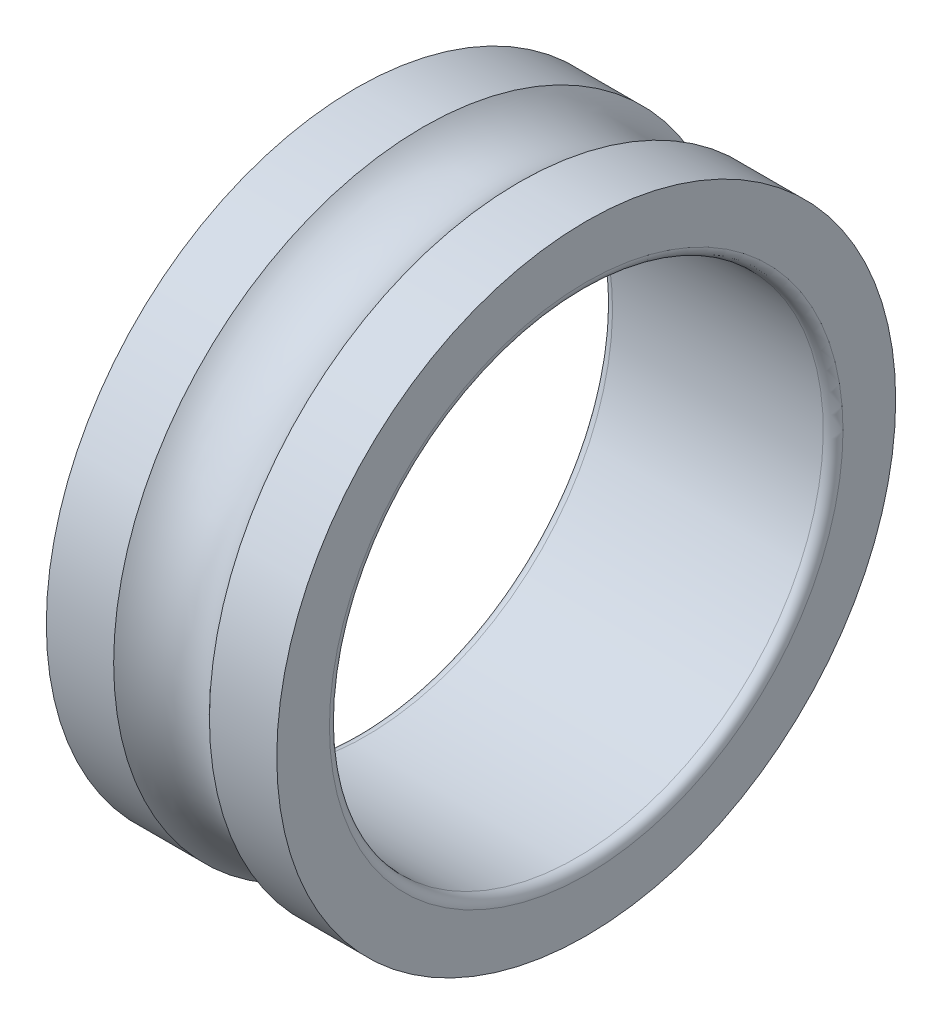
ISO-10303-21;
HEADER;
FILE_DESCRIPTION(('STEP AP214'),'2;1');
FILE_NAME('part.step','',(''),(''),'','','');
FILE_SCHEMA(('AUTOMOTIVE_DESIGN { 1 0 10303 214 1 1 1 1 }'));
ENDSEC;
DATA;
#1=APPLICATION_CONTEXT('core data for automotive mechanical design processes');
#2=APPLICATION_PROTOCOL_DEFINITION('international standard','automotive_design',2000,#1);
#3=PRODUCT_CONTEXT('',#1,'mechanical');
#4=PRODUCT('Part','Part','',(#3));
#5=PRODUCT_RELATED_PRODUCT_CATEGORY('part','',(#4));
#6=PRODUCT_DEFINITION_FORMATION('','',#4);
#7=PRODUCT_DEFINITION_CONTEXT('part definition',#1,'design');
#8=PRODUCT_DEFINITION('design','',#6,#7);
#9=PRODUCT_DEFINITION_SHAPE('','',#8);
#10=(LENGTH_UNIT() NAMED_UNIT(*) SI_UNIT(.MILLI.,.METRE.));
#11=(NAMED_UNIT(*) PLANE_ANGLE_UNIT() SI_UNIT($,.RADIAN.));
#12=(NAMED_UNIT(*) SI_UNIT($,.STERADIAN.) SOLID_ANGLE_UNIT());
#13=UNCERTAINTY_MEASURE_WITH_UNIT(LENGTH_MEASURE(1.E-05),#10,'distance_accuracy_value','');
#14=(GEOMETRIC_REPRESENTATION_CONTEXT(3) GLOBAL_UNCERTAINTY_ASSIGNED_CONTEXT((#13)) GLOBAL_UNIT_ASSIGNED_CONTEXT((#10,
#11,#12)) REPRESENTATION_CONTEXT('',''));
#15=CARTESIAN_POINT('',(0.,0.,0.));
#16=DIRECTION('',(0.,0.,1.));
#17=DIRECTION('',(1.,0.,0.));
#18=AXIS2_PLACEMENT_3D('',#15,#16,#17);
#19=CARTESIAN_POINT('',(5.97727921907614,0.,0.));
#20=DIRECTION('',(-1.,0.,0.));
#21=DIRECTION('',(0.,1.,0.));
#22=AXIS2_PLACEMENT_3D('',#19,#20,#21);
#23=CYLINDRICAL_SURFACE('',#22,9.4);
#24=CARTESIAN_POINT('',(4.95455843815228,0.,0.));
#25=DIRECTION('',(1.,0.,0.));
#26=DIRECTION('',(0.,1.,0.));
#27=AXIS2_PLACEMENT_3D('',#24,#25,#26);
#28=CIRCLE('',#27,9.4);
#29=CARTESIAN_POINT('',(4.95455843815228,9.4,0.));
#30=VERTEX_POINT('',#29);
#31=EDGE_CURVE('E11',#30,#30,#28,.T.);
#32=ORIENTED_EDGE('',*,*,#31,.T.);
#33=EDGE_LOOP('',(#32));
#34=FACE_BOUND('',#33,.T.);
#35=CARTESIAN_POINT('',(7.,0.,0.));
#36=DIRECTION('',(1.,0.,0.));
#37=DIRECTION('',(0.,1.,0.));
#38=AXIS2_PLACEMENT_3D('',#35,#36,#37);
#39=CIRCLE('',#38,9.4);
#40=CARTESIAN_POINT('',(7.,9.4,0.));
#41=VERTEX_POINT('',#40);
#42=EDGE_CURVE('E52',#41,#41,#39,.T.);
#43=ORIENTED_EDGE('',*,*,#42,.F.);
#44=EDGE_LOOP('',(#43));
#45=FACE_BOUND('',#44,.T.);
#46=ADVANCED_FACE('F16',(#34,#45),#23,.T.);
#47=CARTESIAN_POINT('',(3.5,0.,0.));
#48=DIRECTION('',(1.,0.,0.));
#49=DIRECTION('',(0.,0.,-1.));
#50=AXIS2_PLACEMENT_3D('',#47,#48,#49);
#51=TOROIDAL_SURFACE('',#50,10.75,1.9845);
#52=CARTESIAN_POINT('',(2.04544156184773,0.,0.));
#53=DIRECTION('',(1.,0.,0.));
#54=DIRECTION('',(0.,1.,0.));
#55=AXIS2_PLACEMENT_3D('',#52,#53,#54);
#56=CIRCLE('',#55,9.4);
#57=CARTESIAN_POINT('',(2.04544156184773,9.4,0.));
#58=VERTEX_POINT('',#57);
#59=EDGE_CURVE('E25',#58,#58,#56,.T.);
#60=ORIENTED_EDGE('',*,*,#59,.T.);
#61=EDGE_LOOP('',(#60));
#62=FACE_BOUND('',#61,.T.);
#63=ORIENTED_EDGE('',*,*,#31,.F.);
#64=EDGE_LOOP('',(#63));
#65=FACE_BOUND('',#64,.T.);
#66=ADVANCED_FACE('F18',(#62,#65),#51,.F.);
#67=CARTESIAN_POINT('',(1.02272078092386,0.,0.));
#68=DIRECTION('',(-1.,0.,0.));
#69=DIRECTION('',(0.,1.,0.));
#70=AXIS2_PLACEMENT_3D('',#67,#68,#69);
#71=CYLINDRICAL_SURFACE('',#70,9.4);
#72=CARTESIAN_POINT('',(0.,0.,0.));
#73=DIRECTION('',(1.,0.,0.));
#74=DIRECTION('',(0.,1.,0.));
#75=AXIS2_PLACEMENT_3D('',#72,#73,#74);
#76=CIRCLE('',#75,9.4);
#77=CARTESIAN_POINT('',(0.,9.4,0.));
#78=VERTEX_POINT('',#77);
#79=EDGE_CURVE('E64',#78,#78,#76,.T.);
#80=ORIENTED_EDGE('',*,*,#79,.T.);
#81=EDGE_LOOP('',(#80));
#82=FACE_BOUND('',#81,.T.);
#83=ORIENTED_EDGE('',*,*,#59,.F.);
#84=EDGE_LOOP('',(#83));
#85=FACE_BOUND('',#84,.T.);
#86=ADVANCED_FACE('F91',(#82,#85),#71,.T.);
#87=CARTESIAN_POINT('',(0.,8.6,0.));
#88=DIRECTION('',(-1.,0.,0.));
#89=DIRECTION('',(0.,-1.,0.));
#90=AXIS2_PLACEMENT_3D('',#87,#88,#89);
#91=PLANE('',#90);
#92=CARTESIAN_POINT('',(0.,0.,0.));
#93=DIRECTION('',(1.,0.,0.));
#94=DIRECTION('',(0.,1.,0.));
#95=AXIS2_PLACEMENT_3D('',#92,#93,#94);
#96=CIRCLE('',#95,7.8);
#97=CARTESIAN_POINT('',(0.,7.8,0.));
#98=VERTEX_POINT('',#97);
#99=EDGE_CURVE('E65',#98,#98,#96,.T.);
#100=ORIENTED_EDGE('',*,*,#99,.T.);
#101=EDGE_LOOP('',(#100));
#102=FACE_BOUND('',#101,.T.);
#103=ORIENTED_EDGE('',*,*,#79,.F.);
#104=EDGE_LOOP('',(#103));
#105=FACE_BOUND('',#104,.T.);
#106=ADVANCED_FACE('F84',(#102,#105),#91,.T.);
#107=CARTESIAN_POINT('',(0.3,0.,0.));
#108=DIRECTION('',(1.,0.,0.));
#109=DIRECTION('',(0.,0.,-1.));
#110=AXIS2_PLACEMENT_3D('',#107,#108,#109);
#111=TOROIDAL_SURFACE('',#110,7.8,0.3);
#112=CARTESIAN_POINT('',(0.3,0.,0.));
#113=DIRECTION('',(1.,0.,0.));
#114=DIRECTION('',(0.,1.,0.));
#115=AXIS2_PLACEMENT_3D('',#112,#113,#114);
#116=CIRCLE('',#115,7.5);
#117=CARTESIAN_POINT('',(0.3,7.5,0.));
#118=VERTEX_POINT('',#117);
#119=EDGE_CURVE('E20',#118,#118,#116,.T.);
#120=ORIENTED_EDGE('',*,*,#119,.T.);
#121=EDGE_LOOP('',(#120));
#122=FACE_BOUND('',#121,.T.);
#123=ORIENTED_EDGE('',*,*,#99,.F.);
#124=EDGE_LOOP('',(#123));
#125=FACE_BOUND('',#124,.T.);
#126=ADVANCED_FACE('F72',(#122,#125),#111,.T.);
#127=CARTESIAN_POINT('',(3.5,0.,0.));
#128=DIRECTION('',(-1.,0.,0.));
#129=DIRECTION('',(0.,1.,0.));
#130=AXIS2_PLACEMENT_3D('',#127,#128,#129);
#131=CYLINDRICAL_SURFACE('',#130,7.5);
#132=CARTESIAN_POINT('',(6.7,0.,0.));
#133=DIRECTION('',(1.,0.,0.));
#134=DIRECTION('',(0.,1.,0.));
#135=AXIS2_PLACEMENT_3D('',#132,#133,#134);
#136=CIRCLE('',#135,7.5);
#137=CARTESIAN_POINT('',(6.7,7.5,0.));
#138=VERTEX_POINT('',#137);
#139=EDGE_CURVE('E60',#138,#138,#136,.T.);
#140=ORIENTED_EDGE('',*,*,#139,.T.);
#141=EDGE_LOOP('',(#140));
#142=FACE_BOUND('',#141,.T.);
#143=ORIENTED_EDGE('',*,*,#119,.F.);
#144=EDGE_LOOP('',(#143));
#145=FACE_BOUND('',#144,.T.);
#146=ADVANCED_FACE('F75',(#142,#145),#131,.F.);
#147=CARTESIAN_POINT('',(6.7,0.,0.));
#148=DIRECTION('',(1.,0.,0.));
#149=DIRECTION('',(0.,0.,-1.));
#150=AXIS2_PLACEMENT_3D('',#147,#148,#149);
#151=TOROIDAL_SURFACE('',#150,7.8,0.3);
#152=CARTESIAN_POINT('',(7.,0.,0.));
#153=DIRECTION('',(1.,0.,0.));
#154=DIRECTION('',(0.,1.,0.));
#155=AXIS2_PLACEMENT_3D('',#152,#153,#154);
#156=CIRCLE('',#155,7.8);
#157=CARTESIAN_POINT('',(7.,7.8,0.));
#158=VERTEX_POINT('',#157);
#159=EDGE_CURVE('E56',#158,#158,#156,.T.);
#160=ORIENTED_EDGE('',*,*,#159,.T.);
#161=EDGE_LOOP('',(#160));
#162=FACE_BOUND('',#161,.T.);
#163=ORIENTED_EDGE('',*,*,#139,.F.);
#164=EDGE_LOOP('',(#163));
#165=FACE_BOUND('',#164,.T.);
#166=ADVANCED_FACE('F57',(#162,#165),#151,.T.);
#167=CARTESIAN_POINT('',(7.,8.6,0.));
#168=DIRECTION('',(1.,0.,0.));
#169=DIRECTION('',(0.,1.,0.));
#170=AXIS2_PLACEMENT_3D('',#167,#168,#169);
#171=PLANE('',#170);
#172=ORIENTED_EDGE('',*,*,#42,.T.);
#173=EDGE_LOOP('',(#172));
#174=FACE_BOUND('',#173,.T.);
#175=ORIENTED_EDGE('',*,*,#159,.F.);
#176=EDGE_LOOP('',(#175));
#177=FACE_BOUND('',#176,.T.);
#178=ADVANCED_FACE('F82',(#174,#177),#171,.T.);
#179=CLOSED_SHELL('',(#46,#66,#86,#106,#126,#146,#166,#178));
#180=MANIFOLD_SOLID_BREP('B1',#179);
#181=ADVANCED_BREP_SHAPE_REPRESENTATION('',(#18,#180),#14);
#182=SHAPE_DEFINITION_REPRESENTATION(#9,#181);
ENDSEC;
END-ISO-10303-21;
